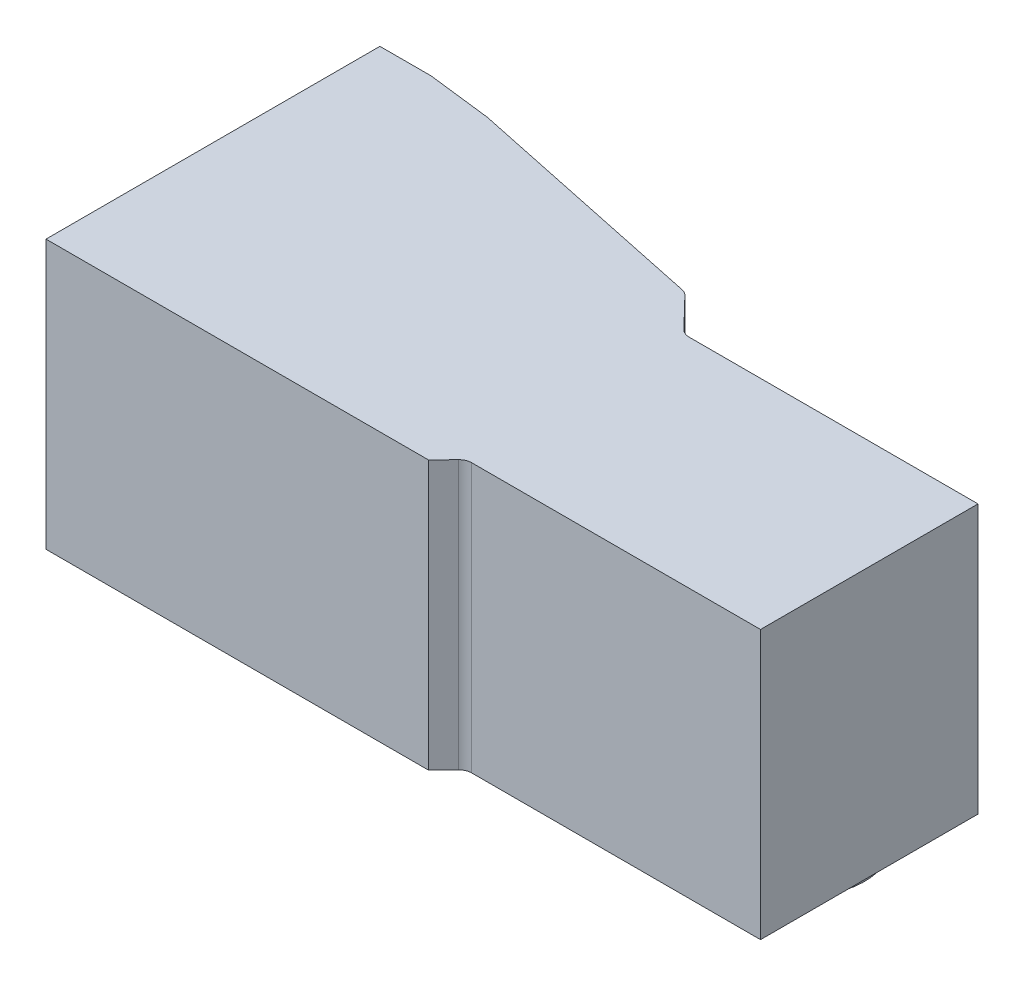
ISO-10303-21;
HEADER;
FILE_DESCRIPTION(('STEP AP214'),'2;1');
FILE_NAME('part.step','',(''),(''),'','','');
FILE_SCHEMA(('AUTOMOTIVE_DESIGN { 1 0 10303 214 1 1 1 1 }'));
ENDSEC;
DATA;
#1=APPLICATION_CONTEXT('core data for automotive mechanical design processes');
#2=APPLICATION_PROTOCOL_DEFINITION('international standard','automotive_design',2000,#1);
#3=PRODUCT_CONTEXT('',#1,'mechanical');
#4=PRODUCT('Part','Part','',(#3));
#5=PRODUCT_RELATED_PRODUCT_CATEGORY('part','',(#4));
#6=PRODUCT_DEFINITION_FORMATION('','',#4);
#7=PRODUCT_DEFINITION_CONTEXT('part definition',#1,'design');
#8=PRODUCT_DEFINITION('design','',#6,#7);
#9=PRODUCT_DEFINITION_SHAPE('','',#8);
#10=(LENGTH_UNIT() NAMED_UNIT(*) SI_UNIT(.MILLI.,.METRE.));
#11=(NAMED_UNIT(*) PLANE_ANGLE_UNIT() SI_UNIT($,.RADIAN.));
#12=(NAMED_UNIT(*) SI_UNIT($,.STERADIAN.) SOLID_ANGLE_UNIT());
#13=UNCERTAINTY_MEASURE_WITH_UNIT(LENGTH_MEASURE(1.E-05),#10,'distance_accuracy_value','');
#14=(GEOMETRIC_REPRESENTATION_CONTEXT(3) GLOBAL_UNCERTAINTY_ASSIGNED_CONTEXT((#13)) GLOBAL_UNIT_ASSIGNED_CONTEXT((#10,
#11,#12)) REPRESENTATION_CONTEXT('',''));
#15=CARTESIAN_POINT('',(0.,0.,0.));
#16=DIRECTION('',(0.,0.,1.));
#17=DIRECTION('',(1.,0.,0.));
#18=AXIS2_PLACEMENT_3D('',#15,#16,#17);
#19=CARTESIAN_POINT('',(-177.169811320755,210.,160.999367100989));
#20=DIRECTION('',(1.,0.,0.));
#21=DIRECTION('',(0.,0.,-1.));
#22=AXIS2_PLACEMENT_3D('',#19,#20,#21);
#23=PLANE('',#22);
#24=DIRECTION('',(0.,1.,0.));
#25=VECTOR('',#24,1.);
#26=CARTESIAN_POINT('',(-177.169811320755,-5.,100.));
#27=LINE('',#26,#25);
#28=CARTESIAN_POINT('',(-177.169811320755,0.,100.));
#29=VERTEX_POINT('',#28);
#30=CARTESIAN_POINT('',(-177.169811320755,210.,100.));
#31=VERTEX_POINT('',#30);
#32=EDGE_CURVE('E146',#29,#31,#27,.T.);
#33=ORIENTED_EDGE('',*,*,#32,.T.);
#34=DIRECTION('',(0.,0.,1.));
#35=VECTOR('',#34,1.);
#36=CARTESIAN_POINT('',(-177.169811320755,210.,160.999367100989));
#37=LINE('',#36,#35);
#38=CARTESIAN_POINT('',(-177.169811320755,210.,-160.999367100989));
#39=VERTEX_POINT('',#38);
#40=EDGE_CURVE('E157',#39,#31,#37,.T.);
#41=ORIENTED_EDGE('',*,*,#40,.F.);
#42=DIRECTION('',(0.,-1.,0.));
#43=VECTOR('',#42,1.);
#44=CARTESIAN_POINT('',(-177.169811320755,210.,-160.999367100989));
#45=LINE('',#44,#43);
#46=CARTESIAN_POINT('',(-177.169811320755,0.,-160.999367100989));
#47=VERTEX_POINT('',#46);
#48=EDGE_CURVE('E190',#39,#47,#45,.T.);
#49=ORIENTED_EDGE('',*,*,#48,.T.);
#50=DIRECTION('',(0.,0.,1.));
#51=VECTOR('',#50,1.);
#52=CARTESIAN_POINT('',(-177.169811320755,0.,160.999367100989));
#53=LINE('',#52,#51);
#54=EDGE_CURVE('E159',#47,#29,#53,.T.);
#55=ORIENTED_EDGE('',*,*,#54,.T.);
#56=EDGE_LOOP('',(#33,#41,#49,#55));
#57=FACE_BOUND('',#56,.T.);
#58=ADVANCED_FACE('F36',(#57),#23,.F.);
#59=CARTESIAN_POINT('',(108.540145676595,210.,113.759535041964));
#60=DIRECTION('',(-0.718988376049109,0.,-0.695022096847478));
#61=DIRECTION('',(-0.695022096847478,0.,0.718988376049109));
#62=AXIS2_PLACEMENT_3D('',#59,#60,#61);
#63=PLANE('',#62);
#64=DIRECTION('',(0.695022096847478,0.,-0.718988376049109));
#65=VECTOR('',#64,1.);
#66=CARTESIAN_POINT('',(108.540145676595,210.,113.759535041964));
#67=LINE('',#66,#65);
#68=CARTESIAN_POINT('',(121.841029550494,210.,100.));
#69=VERTEX_POINT('',#68);
#70=CARTESIAN_POINT('',(133.392909820019,210.,88.0497790315252));
#71=VERTEX_POINT('',#70);
#72=EDGE_CURVE('E166',#69,#71,#67,.T.);
#73=ORIENTED_EDGE('',*,*,#72,.F.);
#74=DIRECTION('',(0.,1.,0.));
#75=VECTOR('',#74,1.);
#76=CARTESIAN_POINT('',(121.841029550494,210.,100.));
#77=LINE('',#76,#75);
#78=CARTESIAN_POINT('',(121.841029550494,0.,100.));
#79=VERTEX_POINT('',#78);
#80=EDGE_CURVE('E149',#79,#69,#77,.T.);
#81=ORIENTED_EDGE('',*,*,#80,.F.);
#82=DIRECTION('',(0.695022096847478,0.,-0.718988376049109));
#83=VECTOR('',#82,1.);
#84=CARTESIAN_POINT('',(108.540145676595,0.,113.759535041964));
#85=LINE('',#84,#83);
#86=CARTESIAN_POINT('',(133.392909820019,0.,88.0497790315252));
#87=VERTEX_POINT('',#86);
#88=EDGE_CURVE('E192',#79,#87,#85,.T.);
#89=ORIENTED_EDGE('',*,*,#88,.T.);
#90=DIRECTION('',(0.,-1.,0.));
#91=VECTOR('',#90,1.);
#92=CARTESIAN_POINT('',(133.392909820019,210.,88.0497790315252));
#93=LINE('',#92,#91);
#94=EDGE_CURVE('E219',#87,#71,#93,.F.);
#95=ORIENTED_EDGE('',*,*,#94,.T.);
#96=EDGE_LOOP('',(#73,#81,#89,#95));
#97=FACE_BOUND('',#96,.T.);
#98=ADVANCED_FACE('F314',(#97),#63,.F.);
#99=CARTESIAN_POINT('',(0.,210.,0.));
#100=DIRECTION('',(0.,-1.,0.));
#101=DIRECTION('',(0.,0.,-1.));
#102=AXIS2_PLACEMENT_3D('',#99,#100,#101);
#103=PLANE('',#102);
#104=DIRECTION('',(1.,0.,0.));
#105=VECTOR('',#104,1.);
#106=CARTESIAN_POINT('',(-177.169811320755,210.,100.));
#107=LINE('',#106,#105);
#108=EDGE_CURVE('E143',#31,#69,#107,.T.);
#109=ORIENTED_EDGE('',*,*,#108,.T.);
#110=ORIENTED_EDGE('',*,*,#72,.T.);
#111=CARTESIAN_POINT('',(140.582793580511,210.,95.));
#112=DIRECTION('',(0.,-1.,0.));
#113=DIRECTION('',(0.,0.,-1.));
#114=AXIS2_PLACEMENT_3D('',#111,#112,#113);
#115=CIRCLE('',#114,10.);
#116=CARTESIAN_POINT('',(140.582793580511,210.,85.));
#117=VERTEX_POINT('',#116);
#118=EDGE_CURVE('E224',#71,#117,#115,.T.);
#119=ORIENTED_EDGE('',*,*,#118,.T.);
#120=DIRECTION('',(1.,0.,0.));
#121=VECTOR('',#120,1.);
#122=CARTESIAN_POINT('',(136.341029550494,210.,85.));
#123=LINE('',#122,#121);
#124=CARTESIAN_POINT('',(366.341029550494,210.,85.));
#125=VERTEX_POINT('',#124);
#126=EDGE_CURVE('E169',#117,#125,#123,.T.);
#127=ORIENTED_EDGE('',*,*,#126,.T.);
#128=DIRECTION('',(0.,0.,-1.));
#129=VECTOR('',#128,1.);
#130=CARTESIAN_POINT('',(366.341029550494,210.,85.));
#131=LINE('',#130,#129);
#132=CARTESIAN_POINT('',(366.341029550494,210.,-85.));
#133=VERTEX_POINT('',#132);
#134=EDGE_CURVE('E177',#125,#133,#131,.T.);
#135=ORIENTED_EDGE('',*,*,#134,.T.);
#136=DIRECTION('',(-1.,0.,0.));
#137=VECTOR('',#136,1.);
#138=CARTESIAN_POINT('',(136.341029550494,210.,-85.));
#139=LINE('',#138,#137);
#140=CARTESIAN_POINT('',(140.58279358051,210.,-85.));
#141=VERTEX_POINT('',#140);
#142=EDGE_CURVE('E179',#133,#141,#139,.T.);
#143=ORIENTED_EDGE('',*,*,#142,.T.);
#144=CARTESIAN_POINT('',(140.58279358051,210.,-95.));
#145=DIRECTION('',(0.,-1.,0.));
#146=DIRECTION('',(0.,0.,-1.));
#147=AXIS2_PLACEMENT_3D('',#144,#145,#146);
#148=CIRCLE('',#147,10.);
#149=CARTESIAN_POINT('',(133.392909820019,210.,-88.0497790315253));
#150=VERTEX_POINT('',#149);
#151=EDGE_CURVE('E11',#141,#150,#148,.T.);
#152=ORIENTED_EDGE('',*,*,#151,.T.);
#153=DIRECTION('',(-0.695022096847478,0.,-0.718988376049109));
#154=VECTOR('',#153,1.);
#155=CARTESIAN_POINT('',(108.540145676595,210.,-113.759535041964));
#156=LINE('',#155,#154);
#157=CARTESIAN_POINT('',(110.670505155556,210.,-111.555714891315));
#158=VERTEX_POINT('',#157);
#159=EDGE_CURVE('E182',#150,#158,#156,.T.);
#160=ORIENTED_EDGE('',*,*,#159,.T.);
#161=CARTESIAN_POINT('',(103.480621395064,210.,-104.60549392284));
#162=DIRECTION('',(0.,-1.,0.));
#163=DIRECTION('',(0.,0.,-1.));
#164=AXIS2_PLACEMENT_3D('',#161,#162,#163);
#165=CIRCLE('',#164,10.);
#166=CARTESIAN_POINT('',(105.540726205563,210.,-114.390991772708));
#167=VERTEX_POINT('',#166);
#168=EDGE_CURVE('E58',#158,#167,#165,.F.);
#169=ORIENTED_EDGE('',*,*,#168,.T.);
#170=DIRECTION('',(-0.978549784986749,0.,-0.206010481049842));
#171=VECTOR('',#170,1.);
#172=CARTESIAN_POINT('',(-87.1698113207551,210.,-154.961631251933));
#173=LINE('',#172,#171);
#174=CARTESIAN_POINT('',(-86.742288324238,210.,-154.871626410561));
#175=VERTEX_POINT('',#174);
#176=EDGE_CURVE('E184',#167,#175,#173,.T.);
#177=ORIENTED_EDGE('',*,*,#176,.T.);
#178=CARTESIAN_POINT('',(-88.8023931347364,210.,-145.086128560693));
#179=DIRECTION('',(0.,-1.,0.));
#180=DIRECTION('',(0.,0.,-1.));
#181=AXIS2_PLACEMENT_3D('',#178,#179,#180);
#182=CIRCLE('',#181,10.);
#183=CARTESIAN_POINT('',(-87.6035548829823,210.,-155.014007833032));
#184=VERTEX_POINT('',#183);
#185=EDGE_CURVE('E241',#175,#184,#182,.F.);
#186=ORIENTED_EDGE('',*,*,#185,.T.);
#187=DIRECTION('',(-0.992787927233864,0.,-0.11988382517541));
#188=VECTOR('',#187,1.);
#189=CARTESIAN_POINT('',(-137.169811320755,210.,-160.999367100989));
#190=LINE('',#189,#188);
#191=CARTESIAN_POINT('',(-136.57256154481,210.,-160.927246373328));
#192=VERTEX_POINT('',#191);
#193=EDGE_CURVE('E186',#184,#192,#190,.T.);
#194=ORIENTED_EDGE('',*,*,#193,.T.);
#195=CARTESIAN_POINT('',(-137.771399796564,210.,-150.999367100989));
#196=DIRECTION('',(0.,-1.,0.));
#197=DIRECTION('',(0.,0.,-1.));
#198=AXIS2_PLACEMENT_3D('',#195,#196,#197);
#199=CIRCLE('',#198,10.);
#200=CARTESIAN_POINT('',(-137.771399796564,210.,-160.999367100989));
#201=VERTEX_POINT('',#200);
#202=EDGE_CURVE('E243',#192,#201,#199,.F.);
#203=ORIENTED_EDGE('',*,*,#202,.T.);
#204=DIRECTION('',(-1.,0.,0.));
#205=VECTOR('',#204,1.);
#206=CARTESIAN_POINT('',(-177.169811320755,210.,-160.999367100989));
#207=LINE('',#206,#205);
#208=EDGE_CURVE('E164',#201,#39,#207,.T.);
#209=ORIENTED_EDGE('',*,*,#208,.T.);
#210=ORIENTED_EDGE('',*,*,#40,.T.);
#211=EDGE_LOOP('',(#109,#110,#119,#127,#135,#143,#152,#160,#169,#177,#186,#194,#203,#209,#210));
#212=FACE_BOUND('',#211,.T.);
#213=ADVANCED_FACE('F162',(#212),#103,.F.);
#214=CARTESIAN_POINT('',(0.,0.,0.));
#215=DIRECTION('',(0.,-1.,0.));
#216=DIRECTION('',(0.,0.,-1.));
#217=AXIS2_PLACEMENT_3D('',#214,#215,#216);
#218=PLANE('',#217);
#219=CARTESIAN_POINT('',(312.605658758333,0.,0.));
#220=DIRECTION('',(0.,-1.,0.));
#221=DIRECTION('',(0.,0.,-1.));
#222=AXIS2_PLACEMENT_3D('',#219,#220,#221);
#223=CIRCLE('',#222,50.);
#224=CARTESIAN_POINT('',(312.605658758333,0.,-50.));
#225=VERTEX_POINT('',#224);
#226=EDGE_CURVE('E160',#225,#225,#223,.T.);
#227=ORIENTED_EDGE('',*,*,#226,.F.);
#228=EDGE_LOOP('',(#227));
#229=FACE_BOUND('',#228,.T.);
#230=DIRECTION('',(-1.,0.,0.));
#231=VECTOR('',#230,1.);
#232=CARTESIAN_POINT('',(-177.169811320755,0.,-160.999367100989));
#233=LINE('',#232,#231);
#234=CARTESIAN_POINT('',(-137.771399796564,0.,-160.999367100989));
#235=VERTEX_POINT('',#234);
#236=EDGE_CURVE('E167',#235,#47,#233,.T.);
#237=ORIENTED_EDGE('',*,*,#236,.F.);
#238=CARTESIAN_POINT('',(-137.771399796564,0.,-150.999367100989));
#239=DIRECTION('',(0.,-1.,0.));
#240=DIRECTION('',(0.,0.,-1.));
#241=AXIS2_PLACEMENT_3D('',#238,#239,#240);
#242=CIRCLE('',#241,10.);
#243=CARTESIAN_POINT('',(-136.57256154481,0.,-160.927246373328));
#244=VERTEX_POINT('',#243);
#245=EDGE_CURVE('E233',#235,#244,#242,.T.);
#246=ORIENTED_EDGE('',*,*,#245,.T.);
#247=DIRECTION('',(-0.992787927233864,0.,-0.11988382517541));
#248=VECTOR('',#247,1.);
#249=CARTESIAN_POINT('',(-137.169811320755,0.,-160.999367100989));
#250=LINE('',#249,#248);
#251=CARTESIAN_POINT('',(-87.6035548829823,0.,-155.014007833032));
#252=VERTEX_POINT('',#251);
#253=EDGE_CURVE('E171',#252,#244,#250,.T.);
#254=ORIENTED_EDGE('',*,*,#253,.F.);
#255=CARTESIAN_POINT('',(-88.8023931347364,0.,-145.086128560693));
#256=DIRECTION('',(0.,-1.,0.));
#257=DIRECTION('',(0.,0.,-1.));
#258=AXIS2_PLACEMENT_3D('',#255,#256,#257);
#259=CIRCLE('',#258,10.);
#260=CARTESIAN_POINT('',(-86.742288324238,0.,-154.871626410561));
#261=VERTEX_POINT('',#260);
#262=EDGE_CURVE('E231',#252,#261,#259,.T.);
#263=ORIENTED_EDGE('',*,*,#262,.T.);
#264=DIRECTION('',(-0.978549784986749,0.,-0.206010481049842));
#265=VECTOR('',#264,1.);
#266=CARTESIAN_POINT('',(-87.1698113207551,0.,-154.961631251933));
#267=LINE('',#266,#265);
#268=CARTESIAN_POINT('',(105.540726205563,0.,-114.390991772708));
#269=VERTEX_POINT('',#268);
#270=EDGE_CURVE('E205',#269,#261,#267,.T.);
#271=ORIENTED_EDGE('',*,*,#270,.F.);
#272=CARTESIAN_POINT('',(103.480621395064,0.,-104.60549392284));
#273=DIRECTION('',(0.,-1.,0.));
#274=DIRECTION('',(0.,0.,-1.));
#275=AXIS2_PLACEMENT_3D('',#272,#273,#274);
#276=CIRCLE('',#275,10.);
#277=CARTESIAN_POINT('',(110.670505155556,0.,-111.555714891315));
#278=VERTEX_POINT('',#277);
#279=EDGE_CURVE('E229',#269,#278,#276,.T.);
#280=ORIENTED_EDGE('',*,*,#279,.T.);
#281=DIRECTION('',(-0.695022096847478,0.,-0.718988376049109));
#282=VECTOR('',#281,1.);
#283=CARTESIAN_POINT('',(108.540145676595,0.,-113.759535041964));
#284=LINE('',#283,#282);
#285=CARTESIAN_POINT('',(133.392909820019,0.,-88.0497790315253));
#286=VERTEX_POINT('',#285);
#287=EDGE_CURVE('E202',#286,#278,#284,.T.);
#288=ORIENTED_EDGE('',*,*,#287,.F.);
#289=CARTESIAN_POINT('',(140.58279358051,0.,-95.));
#290=DIRECTION('',(0.,-1.,0.));
#291=DIRECTION('',(0.,0.,-1.));
#292=AXIS2_PLACEMENT_3D('',#289,#290,#291);
#293=CIRCLE('',#292,10.);
#294=CARTESIAN_POINT('',(140.58279358051,0.,-85.));
#295=VERTEX_POINT('',#294);
#296=EDGE_CURVE('E44',#286,#295,#293,.F.);
#297=ORIENTED_EDGE('',*,*,#296,.T.);
#298=DIRECTION('',(-1.,0.,0.));
#299=VECTOR('',#298,1.);
#300=CARTESIAN_POINT('',(136.341029550494,0.,-85.));
#301=LINE('',#300,#299);
#302=CARTESIAN_POINT('',(366.341029550494,0.,-85.));
#303=VERTEX_POINT('',#302);
#304=EDGE_CURVE('E199',#303,#295,#301,.T.);
#305=ORIENTED_EDGE('',*,*,#304,.F.);
#306=DIRECTION('',(0.,0.,-1.));
#307=VECTOR('',#306,1.);
#308=CARTESIAN_POINT('',(366.341029550494,0.,85.));
#309=LINE('',#308,#307);
#310=CARTESIAN_POINT('',(366.341029550494,0.,85.));
#311=VERTEX_POINT('',#310);
#312=EDGE_CURVE('E197',#311,#303,#309,.T.);
#313=ORIENTED_EDGE('',*,*,#312,.F.);
#314=DIRECTION('',(1.,0.,0.));
#315=VECTOR('',#314,1.);
#316=CARTESIAN_POINT('',(136.341029550494,0.,85.));
#317=LINE('',#316,#315);
#318=CARTESIAN_POINT('',(140.582793580511,0.,85.));
#319=VERTEX_POINT('',#318);
#320=EDGE_CURVE('E195',#319,#311,#317,.T.);
#321=ORIENTED_EDGE('',*,*,#320,.F.);
#322=CARTESIAN_POINT('',(140.582793580511,0.,95.));
#323=DIRECTION('',(0.,-1.,0.));
#324=DIRECTION('',(0.,0.,-1.));
#325=AXIS2_PLACEMENT_3D('',#322,#323,#324);
#326=CIRCLE('',#325,10.);
#327=EDGE_CURVE('E222',#319,#87,#326,.F.);
#328=ORIENTED_EDGE('',*,*,#327,.T.);
#329=ORIENTED_EDGE('',*,*,#88,.F.);
#330=DIRECTION('',(1.,0.,0.));
#331=VECTOR('',#330,1.);
#332=CARTESIAN_POINT('',(366.341029550494,0.,100.));
#333=LINE('',#332,#331);
#334=EDGE_CURVE('E294',#29,#79,#333,.T.);
#335=ORIENTED_EDGE('',*,*,#334,.F.);
#336=ORIENTED_EDGE('',*,*,#54,.F.);
#337=EDGE_LOOP('',(#237,#246,#254,#263,#271,#280,#288,#297,#305,#313,#321,#328,#329,#335,#336));
#338=FACE_BOUND('',#337,.T.);
#339=ADVANCED_FACE('F259',(#229,#338),#218,.T.);
#340=CARTESIAN_POINT('',(136.341029550494,210.,85.));
#341=DIRECTION('',(0.,0.,-1.));
#342=DIRECTION('',(-1.,0.,0.));
#343=AXIS2_PLACEMENT_3D('',#340,#341,#342);
#344=PLANE('',#343);
#345=ORIENTED_EDGE('',*,*,#126,.F.);
#346=DIRECTION('',(0.,-1.,0.));
#347=VECTOR('',#346,1.);
#348=CARTESIAN_POINT('',(140.582793580511,0.,85.));
#349=LINE('',#348,#347);
#350=EDGE_CURVE('E216',#117,#319,#349,.T.);
#351=ORIENTED_EDGE('',*,*,#350,.T.);
#352=ORIENTED_EDGE('',*,*,#320,.T.);
#353=DIRECTION('',(0.,-1.,0.));
#354=VECTOR('',#353,1.);
#355=CARTESIAN_POINT('',(366.341029550494,210.,85.));
#356=LINE('',#355,#354);
#357=EDGE_CURVE('E213',#125,#311,#356,.T.);
#358=ORIENTED_EDGE('',*,*,#357,.F.);
#359=EDGE_LOOP('',(#345,#351,#352,#358));
#360=FACE_BOUND('',#359,.T.);
#361=ADVANCED_FACE('F305',(#360),#344,.F.);
#362=CARTESIAN_POINT('',(366.341029550494,210.,85.));
#363=DIRECTION('',(-1.,0.,0.));
#364=DIRECTION('',(0.,0.,1.));
#365=AXIS2_PLACEMENT_3D('',#362,#363,#364);
#366=PLANE('',#365);
#367=ORIENTED_EDGE('',*,*,#312,.T.);
#368=DIRECTION('',(0.,-1.,0.));
#369=VECTOR('',#368,1.);
#370=CARTESIAN_POINT('',(366.341029550494,210.,-85.));
#371=LINE('',#370,#369);
#372=EDGE_CURVE('E210',#133,#303,#371,.T.);
#373=ORIENTED_EDGE('',*,*,#372,.F.);
#374=ORIENTED_EDGE('',*,*,#134,.F.);
#375=ORIENTED_EDGE('',*,*,#357,.T.);
#376=EDGE_LOOP('',(#367,#373,#374,#375));
#377=FACE_BOUND('',#376,.T.);
#378=ADVANCED_FACE('F311',(#377),#366,.F.);
#379=CARTESIAN_POINT('',(136.341029550494,210.,-85.));
#380=DIRECTION('',(0.,0.,1.));
#381=DIRECTION('',(1.,0.,0.));
#382=AXIS2_PLACEMENT_3D('',#379,#380,#381);
#383=PLANE('',#382);
#384=ORIENTED_EDGE('',*,*,#304,.T.);
#385=DIRECTION('',(0.,-1.,0.));
#386=VECTOR('',#385,1.);
#387=CARTESIAN_POINT('',(140.58279358051,210.,-85.));
#388=LINE('',#387,#386);
#389=EDGE_CURVE('E254',#295,#141,#388,.F.);
#390=ORIENTED_EDGE('',*,*,#389,.T.);
#391=ORIENTED_EDGE('',*,*,#142,.F.);
#392=ORIENTED_EDGE('',*,*,#372,.T.);
#393=EDGE_LOOP('',(#384,#390,#391,#392));
#394=FACE_BOUND('',#393,.T.);
#395=ADVANCED_FACE('F265',(#394),#383,.F.);
#396=CARTESIAN_POINT('',(108.540145676595,210.,-113.759535041964));
#397=DIRECTION('',(-0.718988376049109,0.,0.695022096847478));
#398=DIRECTION('',(0.695022096847478,0.,0.718988376049109));
#399=AXIS2_PLACEMENT_3D('',#396,#397,#398);
#400=PLANE('',#399);
#401=ORIENTED_EDGE('',*,*,#287,.T.);
#402=DIRECTION('',(0.,-1.,0.));
#403=VECTOR('',#402,1.);
#404=CARTESIAN_POINT('',(110.670505155556,210.,-111.555714891315));
#405=LINE('',#404,#403);
#406=EDGE_CURVE('E252',#278,#158,#405,.F.);
#407=ORIENTED_EDGE('',*,*,#406,.T.);
#408=ORIENTED_EDGE('',*,*,#159,.F.);
#409=DIRECTION('',(0.,-1.,0.));
#410=VECTOR('',#409,1.);
#411=CARTESIAN_POINT('',(133.392909820019,0.,-88.0497790315253));
#412=LINE('',#411,#410);
#413=EDGE_CURVE('E249',#150,#286,#412,.T.);
#414=ORIENTED_EDGE('',*,*,#413,.T.);
#415=EDGE_LOOP('',(#401,#407,#408,#414));
#416=FACE_BOUND('',#415,.T.);
#417=ADVANCED_FACE('F271',(#416),#400,.F.);
#418=CARTESIAN_POINT('',(-87.1698113207551,210.,-154.961631251933));
#419=DIRECTION('',(-0.206010481049842,0.,0.978549784986749));
#420=DIRECTION('',(0.978549784986749,0.,0.206010481049842));
#421=AXIS2_PLACEMENT_3D('',#418,#419,#420);
#422=PLANE('',#421);
#423=ORIENTED_EDGE('',*,*,#270,.T.);
#424=DIRECTION('',(0.,-1.,0.));
#425=VECTOR('',#424,1.);
#426=CARTESIAN_POINT('',(-86.742288324238,210.,-154.871626410561));
#427=LINE('',#426,#425);
#428=EDGE_CURVE('E51',#261,#175,#427,.F.);
#429=ORIENTED_EDGE('',*,*,#428,.T.);
#430=ORIENTED_EDGE('',*,*,#176,.F.);
#431=DIRECTION('',(0.,-1.,0.));
#432=VECTOR('',#431,1.);
#433=CARTESIAN_POINT('',(105.540726205563,210.,-114.390991772708));
#434=LINE('',#433,#432);
#435=EDGE_CURVE('E245',#167,#269,#434,.T.);
#436=ORIENTED_EDGE('',*,*,#435,.T.);
#437=EDGE_LOOP('',(#423,#429,#430,#436));
#438=FACE_BOUND('',#437,.T.);
#439=ADVANCED_FACE('F277',(#438),#422,.F.);
#440=CARTESIAN_POINT('',(-137.169811320755,210.,-160.999367100989));
#441=DIRECTION('',(-0.11988382517541,0.,0.992787927233864));
#442=DIRECTION('',(0.992787927233864,0.,0.11988382517541));
#443=AXIS2_PLACEMENT_3D('',#440,#441,#442);
#444=PLANE('',#443);
#445=ORIENTED_EDGE('',*,*,#253,.T.);
#446=DIRECTION('',(0.,-1.,0.));
#447=VECTOR('',#446,1.);
#448=CARTESIAN_POINT('',(-136.57256154481,210.,-160.927246373328));
#449=LINE('',#448,#447);
#450=EDGE_CURVE('E238',#244,#192,#449,.F.);
#451=ORIENTED_EDGE('',*,*,#450,.T.);
#452=ORIENTED_EDGE('',*,*,#193,.F.);
#453=DIRECTION('',(0.,-1.,0.));
#454=VECTOR('',#453,1.);
#455=CARTESIAN_POINT('',(-87.6035548829823,210.,-155.014007833032));
#456=LINE('',#455,#454);
#457=EDGE_CURVE('E235',#184,#252,#456,.T.);
#458=ORIENTED_EDGE('',*,*,#457,.T.);
#459=EDGE_LOOP('',(#445,#451,#452,#458));
#460=FACE_BOUND('',#459,.T.);
#461=ADVANCED_FACE('F285',(#460),#444,.F.);
#462=CARTESIAN_POINT('',(-177.169811320755,210.,-160.999367100989));
#463=DIRECTION('',(0.,0.,1.));
#464=DIRECTION('',(1.,0.,0.));
#465=AXIS2_PLACEMENT_3D('',#462,#463,#464);
#466=PLANE('',#465);
#467=ORIENTED_EDGE('',*,*,#208,.F.);
#468=DIRECTION('',(0.,-1.,0.));
#469=VECTOR('',#468,1.);
#470=CARTESIAN_POINT('',(-137.771399796564,210.,-160.999367100989));
#471=LINE('',#470,#469);
#472=EDGE_CURVE('E226',#201,#235,#471,.T.);
#473=ORIENTED_EDGE('',*,*,#472,.T.);
#474=ORIENTED_EDGE('',*,*,#236,.T.);
#475=ORIENTED_EDGE('',*,*,#48,.F.);
#476=EDGE_LOOP('',(#467,#473,#474,#475));
#477=FACE_BOUND('',#476,.T.);
#478=ADVANCED_FACE('F292',(#477),#466,.F.);
#479=CARTESIAN_POINT('',(0.,0.,100.));
#480=DIRECTION('',(0.,0.,1.));
#481=DIRECTION('',(1.,0.,0.));
#482=AXIS2_PLACEMENT_3D('',#479,#480,#481);
#483=PLANE('',#482);
#484=ORIENTED_EDGE('',*,*,#80,.T.);
#485=ORIENTED_EDGE('',*,*,#108,.F.);
#486=ORIENTED_EDGE('',*,*,#32,.F.);
#487=ORIENTED_EDGE('',*,*,#334,.T.);
#488=EDGE_LOOP('',(#484,#485,#486,#487));
#489=FACE_BOUND('',#488,.T.);
#490=ADVANCED_FACE('F145',(#489),#483,.T.);
#491=CARTESIAN_POINT('',(140.582793580511,210.,95.));
#492=DIRECTION('',(0.,1.,0.));
#493=DIRECTION('',(0.,0.,1.));
#494=AXIS2_PLACEMENT_3D('',#491,#492,#493);
#495=CYLINDRICAL_SURFACE('',#494,10.);
#496=ORIENTED_EDGE('',*,*,#118,.F.);
#497=ORIENTED_EDGE('',*,*,#94,.F.);
#498=ORIENTED_EDGE('',*,*,#327,.F.);
#499=ORIENTED_EDGE('',*,*,#350,.F.);
#500=EDGE_LOOP('',(#496,#497,#498,#499));
#501=FACE_BOUND('',#500,.T.);
#502=ADVANCED_FACE('F325',(#501),#495,.F.);
#503=CARTESIAN_POINT('',(-137.771399796564,210.,-150.999367100989));
#504=DIRECTION('',(0.,-1.,0.));
#505=DIRECTION('',(0.,0.,-1.));
#506=AXIS2_PLACEMENT_3D('',#503,#504,#505);
#507=CYLINDRICAL_SURFACE('',#506,10.);
#508=ORIENTED_EDGE('',*,*,#202,.F.);
#509=ORIENTED_EDGE('',*,*,#450,.F.);
#510=ORIENTED_EDGE('',*,*,#245,.F.);
#511=ORIENTED_EDGE('',*,*,#472,.F.);
#512=EDGE_LOOP('',(#508,#509,#510,#511));
#513=FACE_BOUND('',#512,.T.);
#514=ADVANCED_FACE('F290',(#513),#507,.T.);
#515=CARTESIAN_POINT('',(-88.8023931347364,210.,-145.086128560693));
#516=DIRECTION('',(0.,-1.,0.));
#517=DIRECTION('',(0.,0.,-1.));
#518=AXIS2_PLACEMENT_3D('',#515,#516,#517);
#519=CYLINDRICAL_SURFACE('',#518,10.);
#520=ORIENTED_EDGE('',*,*,#185,.F.);
#521=ORIENTED_EDGE('',*,*,#428,.F.);
#522=ORIENTED_EDGE('',*,*,#262,.F.);
#523=ORIENTED_EDGE('',*,*,#457,.F.);
#524=EDGE_LOOP('',(#520,#521,#522,#523));
#525=FACE_BOUND('',#524,.T.);
#526=ADVANCED_FACE('F282',(#525),#519,.T.);
#527=CARTESIAN_POINT('',(103.480621395064,210.,-104.60549392284));
#528=DIRECTION('',(0.,-1.,0.));
#529=DIRECTION('',(0.,0.,-1.));
#530=AXIS2_PLACEMENT_3D('',#527,#528,#529);
#531=CYLINDRICAL_SURFACE('',#530,10.);
#532=ORIENTED_EDGE('',*,*,#168,.F.);
#533=ORIENTED_EDGE('',*,*,#406,.F.);
#534=ORIENTED_EDGE('',*,*,#279,.F.);
#535=ORIENTED_EDGE('',*,*,#435,.F.);
#536=EDGE_LOOP('',(#532,#533,#534,#535));
#537=FACE_BOUND('',#536,.T.);
#538=ADVANCED_FACE('F274',(#537),#531,.T.);
#539=CARTESIAN_POINT('',(140.58279358051,210.,-95.));
#540=DIRECTION('',(0.,1.,0.));
#541=DIRECTION('',(0.,0.,1.));
#542=AXIS2_PLACEMENT_3D('',#539,#540,#541);
#543=CYLINDRICAL_SURFACE('',#542,10.);
#544=ORIENTED_EDGE('',*,*,#151,.F.);
#545=ORIENTED_EDGE('',*,*,#389,.F.);
#546=ORIENTED_EDGE('',*,*,#296,.F.);
#547=ORIENTED_EDGE('',*,*,#413,.F.);
#548=EDGE_LOOP('',(#544,#545,#546,#547));
#549=FACE_BOUND('',#548,.T.);
#550=ADVANCED_FACE('F38',(#549),#543,.F.);
#551=CARTESIAN_POINT('',(312.605658758333,-5.,0.));
#552=DIRECTION('',(0.,1.,0.));
#553=DIRECTION('',(0.,0.,1.));
#554=AXIS2_PLACEMENT_3D('',#551,#552,#553);
#555=CYLINDRICAL_SURFACE('',#554,50.);
#556=CARTESIAN_POINT('',(312.605658758333,-5.,0.));
#557=DIRECTION('',(0.,-1.,0.));
#558=DIRECTION('',(0.,0.,-1.));
#559=AXIS2_PLACEMENT_3D('',#556,#557,#558);
#560=CIRCLE('',#559,50.);
#561=CARTESIAN_POINT('',(312.605658758333,-5.,-50.));
#562=VERTEX_POINT('',#561);
#563=EDGE_CURVE('E295',#562,#562,#560,.T.);
#564=ORIENTED_EDGE('',*,*,#563,.F.);
#565=EDGE_LOOP('',(#564));
#566=FACE_BOUND('',#565,.T.);
#567=ORIENTED_EDGE('',*,*,#226,.T.);
#568=EDGE_LOOP('',(#567));
#569=FACE_BOUND('',#568,.T.);
#570=ADVANCED_FACE('F302',(#566,#569),#555,.T.);
#571=CARTESIAN_POINT('',(312.605658758333,-5.,0.));
#572=DIRECTION('',(0.,-1.,0.));
#573=DIRECTION('',(0.,0.,-1.));
#574=AXIS2_PLACEMENT_3D('',#571,#572,#573);
#575=PLANE('',#574);
#576=ORIENTED_EDGE('',*,*,#563,.T.);
#577=EDGE_LOOP('',(#576));
#578=FACE_BOUND('',#577,.T.);
#579=ADVANCED_FACE('F339',(#578),#575,.T.);
#580=CLOSED_SHELL('',(#58,#98,#213,#339,#361,#378,#395,#417,#439,#461,#478,#490,#502,#514,#526,
#538,#550,#570,#579));
#581=MANIFOLD_SOLID_BREP('B2',#580);
#582=ADVANCED_BREP_SHAPE_REPRESENTATION('',(#18,#581),#14);
#583=SHAPE_DEFINITION_REPRESENTATION(#9,#582);
ENDSEC;
END-ISO-10303-21;
